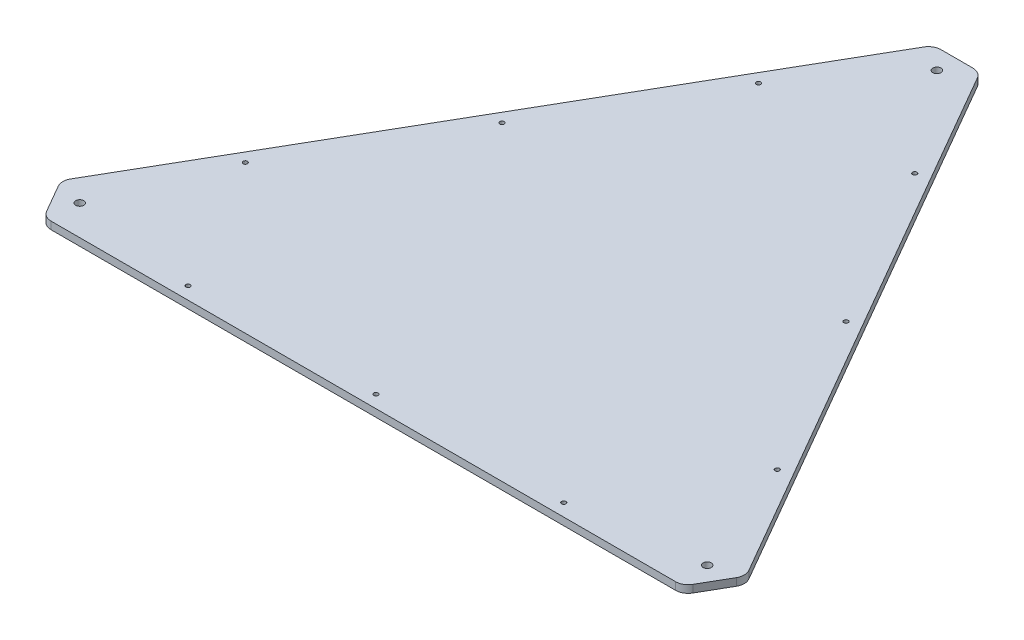
ISO-10303-21;
HEADER;
FILE_DESCRIPTION(('STEP AP214'),'2;1');
FILE_NAME('part.step','',(''),(''),'','','');
FILE_SCHEMA(('AUTOMOTIVE_DESIGN { 1 0 10303 214 1 1 1 1 }'));
ENDSEC;
DATA;
#1=APPLICATION_CONTEXT('core data for automotive mechanical design processes');
#2=APPLICATION_PROTOCOL_DEFINITION('international standard','automotive_design',2000,#1);
#3=PRODUCT_CONTEXT('',#1,'mechanical');
#4=PRODUCT('Part','Part','',(#3));
#5=PRODUCT_RELATED_PRODUCT_CATEGORY('part','',(#4));
#6=PRODUCT_DEFINITION_FORMATION('','',#4);
#7=PRODUCT_DEFINITION_CONTEXT('part definition',#1,'design');
#8=PRODUCT_DEFINITION('design','',#6,#7);
#9=PRODUCT_DEFINITION_SHAPE('','',#8);
#10=(LENGTH_UNIT() NAMED_UNIT(*) SI_UNIT(.MILLI.,.METRE.));
#11=(NAMED_UNIT(*) PLANE_ANGLE_UNIT() SI_UNIT($,.RADIAN.));
#12=(NAMED_UNIT(*) SI_UNIT($,.STERADIAN.) SOLID_ANGLE_UNIT());
#13=UNCERTAINTY_MEASURE_WITH_UNIT(LENGTH_MEASURE(1.E-05),#10,'distance_accuracy_value','');
#14=(GEOMETRIC_REPRESENTATION_CONTEXT(3) GLOBAL_UNCERTAINTY_ASSIGNED_CONTEXT((#13)) GLOBAL_UNIT_ASSIGNED_CONTEXT((#10,
#11,#12)) REPRESENTATION_CONTEXT('',''));
#15=CARTESIAN_POINT('',(0.,0.,0.));
#16=DIRECTION('',(0.,0.,1.));
#17=DIRECTION('',(1.,0.,0.));
#18=AXIS2_PLACEMENT_3D('',#15,#16,#17);
#19=CARTESIAN_POINT('',(0.,3.,0.));
#20=DIRECTION('',(0.,1.,0.));
#21=DIRECTION('',(0.,0.,1.));
#22=AXIS2_PLACEMENT_3D('',#19,#20,#21);
#23=PLANE('',#22);
#24=CARTESIAN_POINT('',(-150.,3.,158.680979980009));
#25=DIRECTION('',(0.,-1.,0.));
#26=DIRECTION('',(0.,0.,-1.));
#27=AXIS2_PLACEMENT_3D('',#24,#25,#26);
#28=CIRCLE('',#27,1.75);
#29=CARTESIAN_POINT('',(-150.,3.,156.930979980009));
#30=VERTEX_POINT('',#29);
#31=EDGE_CURVE('E333',#30,#30,#28,.T.);
#32=ORIENTED_EDGE('',*,*,#31,.T.);
#33=EDGE_LOOP('',(#32));
#34=FACE_BOUND('',#33,.T.);
#35=CARTESIAN_POINT('',(0.,3.,158.680979980009));
#36=DIRECTION('',(0.,-1.,0.));
#37=DIRECTION('',(0.,0.,-1.));
#38=AXIS2_PLACEMENT_3D('',#35,#36,#37);
#39=CIRCLE('',#38,1.75);
#40=CARTESIAN_POINT('',(0.,3.,156.930979980009));
#41=VERTEX_POINT('',#40);
#42=EDGE_CURVE('E325',#41,#41,#39,.T.);
#43=ORIENTED_EDGE('',*,*,#42,.T.);
#44=EDGE_LOOP('',(#43));
#45=FACE_BOUND('',#44,.T.);
#46=CARTESIAN_POINT('',(150.,3.,158.680979980009));
#47=DIRECTION('',(0.,-1.,0.));
#48=DIRECTION('',(0.,0.,-1.));
#49=AXIS2_PLACEMENT_3D('',#46,#47,#48);
#50=CIRCLE('',#49,1.75);
#51=CARTESIAN_POINT('',(150.,3.,156.930979980009));
#52=VERTEX_POINT('',#51);
#53=EDGE_CURVE('E317',#52,#52,#50,.T.);
#54=ORIENTED_EDGE('',*,*,#53,.T.);
#55=EDGE_LOOP('',(#54));
#56=FACE_BOUND('',#55,.T.);
#57=CARTESIAN_POINT('',(212.421759760098,3.,50.5633205776612));
#58=DIRECTION('',(0.,-1.,0.));
#59=DIRECTION('',(0.,0.,-1.));
#60=AXIS2_PLACEMENT_3D('',#57,#58,#59);
#61=CIRCLE('',#60,1.75);
#62=CARTESIAN_POINT('',(212.421759760098,3.,48.8133205776612));
#63=VERTEX_POINT('',#62);
#64=EDGE_CURVE('E310',#63,#63,#61,.T.);
#65=ORIENTED_EDGE('',*,*,#64,.T.);
#66=EDGE_LOOP('',(#65));
#67=FACE_BOUND('',#66,.T.);
#68=CARTESIAN_POINT('',(137.421759760098,3.,-79.3404899900046));
#69=DIRECTION('',(0.,-1.,0.));
#70=DIRECTION('',(0.,0.,-1.));
#71=AXIS2_PLACEMENT_3D('',#68,#69,#70);
#72=CIRCLE('',#71,1.75);
#73=CARTESIAN_POINT('',(137.421759760098,3.,-81.0904899900047));
#74=VERTEX_POINT('',#73);
#75=EDGE_CURVE('E299',#74,#74,#72,.T.);
#76=ORIENTED_EDGE('',*,*,#75,.T.);
#77=EDGE_LOOP('',(#76));
#78=FACE_BOUND('',#77,.T.);
#79=CARTESIAN_POINT('',(62.4217597600978,3.,-209.24430055767));
#80=DIRECTION('',(0.,-1.,0.));
#81=DIRECTION('',(0.,0.,-1.));
#82=AXIS2_PLACEMENT_3D('',#79,#80,#81);
#83=CIRCLE('',#82,1.75);
#84=CARTESIAN_POINT('',(62.4217597600978,3.,-210.99430055767));
#85=VERTEX_POINT('',#84);
#86=EDGE_CURVE('E291',#85,#85,#83,.T.);
#87=ORIENTED_EDGE('',*,*,#86,.T.);
#88=EDGE_LOOP('',(#87));
#89=FACE_BOUND('',#88,.T.);
#90=CARTESIAN_POINT('',(-62.4217597600952,3.,-209.244300557669));
#91=DIRECTION('',(0.,-1.,0.));
#92=DIRECTION('',(0.,0.,-1.));
#93=AXIS2_PLACEMENT_3D('',#90,#91,#92);
#94=CIRCLE('',#93,1.75);
#95=CARTESIAN_POINT('',(-62.4217597600952,3.,-210.994300557669));
#96=VERTEX_POINT('',#95);
#97=EDGE_CURVE('E284',#96,#96,#94,.T.);
#98=ORIENTED_EDGE('',*,*,#97,.T.);
#99=EDGE_LOOP('',(#98));
#100=FACE_BOUND('',#99,.T.);
#101=CARTESIAN_POINT('',(-137.421759760098,3.,-79.3404899900046));
#102=DIRECTION('',(0.,-1.,0.));
#103=DIRECTION('',(0.,0.,-1.));
#104=AXIS2_PLACEMENT_3D('',#101,#102,#103);
#105=CIRCLE('',#104,1.75);
#106=CARTESIAN_POINT('',(-137.421759760098,3.,-81.0904899900047));
#107=VERTEX_POINT('',#106);
#108=EDGE_CURVE('E273',#107,#107,#105,.T.);
#109=ORIENTED_EDGE('',*,*,#108,.T.);
#110=EDGE_LOOP('',(#109));
#111=FACE_BOUND('',#110,.T.);
#112=CARTESIAN_POINT('',(-212.4217597601,3.,50.5633205776597));
#113=DIRECTION('',(0.,-1.,0.));
#114=DIRECTION('',(0.,0.,-1.));
#115=AXIS2_PLACEMENT_3D('',#112,#113,#114);
#116=CIRCLE('',#115,1.75);
#117=CARTESIAN_POINT('',(-212.4217597601,3.,48.8133205776597));
#118=VERTEX_POINT('',#117);
#119=EDGE_CURVE('E262',#118,#118,#116,.T.);
#120=ORIENTED_EDGE('',*,*,#119,.T.);
#121=EDGE_LOOP('',(#120));
#122=FACE_BOUND('',#121,.T.);
#123=CARTESIAN_POINT('',(-250.557621135329,3.,144.659510009996));
#124=DIRECTION('',(0.,1.,0.));
#125=DIRECTION('',(0.,0.,1.));
#126=AXIS2_PLACEMENT_3D('',#123,#124,#125);
#127=CIRCLE('',#126,3.25000000000004);
#128=CARTESIAN_POINT('',(-250.557621135329,3.,147.909510009996));
#129=VERTEX_POINT('',#128);
#130=EDGE_CURVE('E243',#129,#129,#127,.T.);
#131=ORIENTED_EDGE('',*,*,#130,.F.);
#132=EDGE_LOOP('',(#131));
#133=FACE_BOUND('',#132,.T.);
#134=DIRECTION('',(0.499999999999942,0.,-0.866025403784472));
#135=VECTOR('',#134,1.);
#136=CARTESIAN_POINT('',(255.164027595881,3.,168.680979980009));
#137=LINE('',#136,#135);
#138=CARTESIAN_POINT('',(258.050778941829,3.,163.680979980008));
#139=VERTEX_POINT('',#138);
#140=CARTESIAN_POINT('',(270.777276249931,3.,141.638040039983));
#141=VERTEX_POINT('',#140);
#142=EDGE_CURVE('E176',#139,#141,#137,.T.);
#143=ORIENTED_EDGE('',*,*,#142,.T.);
#144=CARTESIAN_POINT('',(262.117022212087,3.,136.638040039984));
#145=DIRECTION('',(0.,1.,0.));
#146=DIRECTION('',(0.,0.,1.));
#147=AXIS2_PLACEMENT_3D('',#144,#145,#146);
#148=CIRCLE('',#147,10.);
#149=CARTESIAN_POINT('',(270.777276249931,3.,131.638040039984));
#150=VERTEX_POINT('',#149);
#151=EDGE_CURVE('E229',#141,#150,#148,.T.);
#152=ORIENTED_EDGE('',*,*,#151,.T.);
#153=DIRECTION('',(-0.499999999999996,0.,-0.866025403784441));
#154=VECTOR('',#153,1.);
#155=CARTESIAN_POINT('',(273.664027595879,3.,136.638040039983));
#156=LINE('',#155,#154);
#157=CARTESIAN_POINT('',(21.3867513459481,3.,-300.319020019991));
#158=VERTEX_POINT('',#157);
#159=EDGE_CURVE('E151',#150,#158,#156,.T.);
#160=ORIENTED_EDGE('',*,*,#159,.T.);
#161=CARTESIAN_POINT('',(12.7264973081037,3.,-295.319020019991));
#162=DIRECTION('',(0.,1.,0.));
#163=DIRECTION('',(0.,0.,1.));
#164=AXIS2_PLACEMENT_3D('',#161,#162,#163);
#165=CIRCLE('',#164,10.);
#166=CARTESIAN_POINT('',(12.7264973081037,3.,-305.319020019991));
#167=VERTEX_POINT('',#166);
#168=EDGE_CURVE('E193',#158,#167,#165,.T.);
#169=ORIENTED_EDGE('',*,*,#168,.T.);
#170=DIRECTION('',(-1.,0.,0.));
#171=VECTOR('',#170,1.);
#172=CARTESIAN_POINT('',(18.5,3.,-305.319020019991));
#173=LINE('',#172,#171);
#174=CARTESIAN_POINT('',(-12.7264973081037,3.,-305.319020019991));
#175=VERTEX_POINT('',#174);
#176=EDGE_CURVE('E210',#167,#175,#173,.T.);
#177=ORIENTED_EDGE('',*,*,#176,.T.);
#178=CARTESIAN_POINT('',(-12.7264973081037,3.,-295.319020019991));
#179=DIRECTION('',(0.,1.,0.));
#180=DIRECTION('',(0.,0.,1.));
#181=AXIS2_PLACEMENT_3D('',#178,#179,#180);
#182=CIRCLE('',#181,10.);
#183=CARTESIAN_POINT('',(-21.3867513459481,3.,-300.319020019991));
#184=VERTEX_POINT('',#183);
#185=EDGE_CURVE('E189',#175,#184,#182,.T.);
#186=ORIENTED_EDGE('',*,*,#185,.T.);
#187=DIRECTION('',(-0.499999999999996,0.,0.866025403784441));
#188=VECTOR('',#187,1.);
#189=CARTESIAN_POINT('',(-18.5,3.,-305.319020019991));
#190=LINE('',#189,#188);
#191=CARTESIAN_POINT('',(-270.777276249931,3.,131.638040039984));
#192=VERTEX_POINT('',#191);
#193=EDGE_CURVE('E204',#184,#192,#190,.T.);
#194=ORIENTED_EDGE('',*,*,#193,.T.);
#195=CARTESIAN_POINT('',(-262.117022212087,3.,136.638040039984));
#196=DIRECTION('',(0.,1.,0.));
#197=DIRECTION('',(0.,0.,1.));
#198=AXIS2_PLACEMENT_3D('',#195,#196,#197);
#199=CIRCLE('',#198,10.);
#200=CARTESIAN_POINT('',(-270.777276249931,3.,141.638040039983));
#201=VERTEX_POINT('',#200);
#202=EDGE_CURVE('E224',#192,#201,#199,.T.);
#203=ORIENTED_EDGE('',*,*,#202,.T.);
#204=DIRECTION('',(0.499999999999942,0.,0.866025403784472));
#205=VECTOR('',#204,1.);
#206=CARTESIAN_POINT('',(-273.664027595879,3.,136.638040039983));
#207=LINE('',#206,#205);
#208=CARTESIAN_POINT('',(-258.050778941829,3.,163.680979980008));
#209=VERTEX_POINT('',#208);
#210=EDGE_CURVE('E209',#201,#209,#207,.T.);
#211=ORIENTED_EDGE('',*,*,#210,.T.);
#212=CARTESIAN_POINT('',(-249.390524903984,3.,158.680979980009));
#213=DIRECTION('',(0.,1.,0.));
#214=DIRECTION('',(0.,0.,1.));
#215=AXIS2_PLACEMENT_3D('',#212,#213,#214);
#216=CIRCLE('',#215,10.);
#217=CARTESIAN_POINT('',(-249.390524903984,3.,168.680979980009));
#218=VERTEX_POINT('',#217);
#219=EDGE_CURVE('E62',#209,#218,#216,.T.);
#220=ORIENTED_EDGE('',*,*,#219,.T.);
#221=DIRECTION('',(1.,0.,0.));
#222=VECTOR('',#221,1.);
#223=CARTESIAN_POINT('',(-255.164027595881,3.,168.680979980009));
#224=LINE('',#223,#222);
#225=CARTESIAN_POINT('',(249.390524903984,3.,168.680979980009));
#226=VERTEX_POINT('',#225);
#227=EDGE_CURVE('E177',#218,#226,#224,.T.);
#228=ORIENTED_EDGE('',*,*,#227,.T.);
#229=CARTESIAN_POINT('',(249.390524903984,3.,158.680979980009));
#230=DIRECTION('',(0.,1.,0.));
#231=DIRECTION('',(0.,0.,1.));
#232=AXIS2_PLACEMENT_3D('',#229,#230,#231);
#233=CIRCLE('',#232,10.);
#234=EDGE_CURVE('E223',#226,#139,#233,.T.);
#235=ORIENTED_EDGE('',*,*,#234,.T.);
#236=EDGE_LOOP('',(#143,#152,#160,#169,#177,#186,#194,#203,#211,#220,#228,#235));
#237=FACE_BOUND('',#236,.T.);
#238=CARTESIAN_POINT('',(0.,3.,-289.319020019991));
#239=DIRECTION('',(0.,1.,0.));
#240=DIRECTION('',(0.,0.,1.));
#241=AXIS2_PLACEMENT_3D('',#238,#239,#240);
#242=CIRCLE('',#241,3.25);
#243=CARTESIAN_POINT('',(0.,3.,-286.069020019991));
#244=VERTEX_POINT('',#243);
#245=EDGE_CURVE('E165',#244,#244,#242,.T.);
#246=ORIENTED_EDGE('',*,*,#245,.F.);
#247=EDGE_LOOP('',(#246));
#248=FACE_BOUND('',#247,.T.);
#249=CARTESIAN_POINT('',(250.557621135329,3.,144.659510009996));
#250=DIRECTION('',(0.,1.,0.));
#251=DIRECTION('',(0.,0.,1.));
#252=AXIS2_PLACEMENT_3D('',#249,#250,#251);
#253=CIRCLE('',#252,3.25000000000017);
#254=CARTESIAN_POINT('',(250.557621135329,3.,147.909510009996));
#255=VERTEX_POINT('',#254);
#256=EDGE_CURVE('E261',#255,#255,#253,.T.);
#257=ORIENTED_EDGE('',*,*,#256,.F.);
#258=EDGE_LOOP('',(#257));
#259=FACE_BOUND('',#258,.T.);
#260=ADVANCED_FACE('F40',(#34,#45,#56,#67,#78,#89,#100,#111,#122,#133,#237,#248,#259),#23,.T.);
#261=CARTESIAN_POINT('',(0.,-3.,0.));
#262=DIRECTION('',(0.,1.,0.));
#263=DIRECTION('',(0.,0.,1.));
#264=AXIS2_PLACEMENT_3D('',#261,#262,#263);
#265=PLANE('',#264);
#266=CARTESIAN_POINT('',(-150.,-3.,158.680979980009));
#267=DIRECTION('',(0.,-1.,0.));
#268=DIRECTION('',(0.,0.,-1.));
#269=AXIS2_PLACEMENT_3D('',#266,#267,#268);
#270=CIRCLE('',#269,1.75);
#271=CARTESIAN_POINT('',(-150.,-3.,156.930979980009));
#272=VERTEX_POINT('',#271);
#273=EDGE_CURVE('E338',#272,#272,#270,.T.);
#274=ORIENTED_EDGE('',*,*,#273,.F.);
#275=EDGE_LOOP('',(#274));
#276=FACE_BOUND('',#275,.T.);
#277=CARTESIAN_POINT('',(0.,-3.,158.680979980009));
#278=DIRECTION('',(0.,-1.,0.));
#279=DIRECTION('',(0.,0.,-1.));
#280=AXIS2_PLACEMENT_3D('',#277,#278,#279);
#281=CIRCLE('',#280,1.75);
#282=CARTESIAN_POINT('',(0.,-3.,156.930979980009));
#283=VERTEX_POINT('',#282);
#284=EDGE_CURVE('E330',#283,#283,#281,.T.);
#285=ORIENTED_EDGE('',*,*,#284,.F.);
#286=EDGE_LOOP('',(#285));
#287=FACE_BOUND('',#286,.T.);
#288=CARTESIAN_POINT('',(150.,-3.,158.680979980009));
#289=DIRECTION('',(0.,-1.,0.));
#290=DIRECTION('',(0.,0.,-1.));
#291=AXIS2_PLACEMENT_3D('',#288,#289,#290);
#292=CIRCLE('',#291,1.75);
#293=CARTESIAN_POINT('',(150.,-3.,156.930979980009));
#294=VERTEX_POINT('',#293);
#295=EDGE_CURVE('E322',#294,#294,#292,.T.);
#296=ORIENTED_EDGE('',*,*,#295,.F.);
#297=EDGE_LOOP('',(#296));
#298=FACE_BOUND('',#297,.T.);
#299=CARTESIAN_POINT('',(212.421759760098,-3.,50.5633205776612));
#300=DIRECTION('',(0.,-1.,0.));
#301=DIRECTION('',(0.,0.,-1.));
#302=AXIS2_PLACEMENT_3D('',#299,#300,#301);
#303=CIRCLE('',#302,1.75);
#304=CARTESIAN_POINT('',(212.421759760098,-3.,48.8133205776612));
#305=VERTEX_POINT('',#304);
#306=EDGE_CURVE('E315',#305,#305,#303,.T.);
#307=ORIENTED_EDGE('',*,*,#306,.F.);
#308=EDGE_LOOP('',(#307));
#309=FACE_BOUND('',#308,.T.);
#310=CARTESIAN_POINT('',(137.421759760098,-3.,-79.3404899900046));
#311=DIRECTION('',(0.,-1.,0.));
#312=DIRECTION('',(0.,0.,-1.));
#313=AXIS2_PLACEMENT_3D('',#310,#311,#312);
#314=CIRCLE('',#313,1.75);
#315=CARTESIAN_POINT('',(137.421759760098,-3.,-81.0904899900047));
#316=VERTEX_POINT('',#315);
#317=EDGE_CURVE('E304',#316,#316,#314,.T.);
#318=ORIENTED_EDGE('',*,*,#317,.F.);
#319=EDGE_LOOP('',(#318));
#320=FACE_BOUND('',#319,.T.);
#321=CARTESIAN_POINT('',(62.4217597600978,-3.,-209.24430055767));
#322=DIRECTION('',(0.,-1.,0.));
#323=DIRECTION('',(0.,0.,-1.));
#324=AXIS2_PLACEMENT_3D('',#321,#322,#323);
#325=CIRCLE('',#324,1.75);
#326=CARTESIAN_POINT('',(62.4217597600978,-3.,-210.99430055767));
#327=VERTEX_POINT('',#326);
#328=EDGE_CURVE('E296',#327,#327,#325,.T.);
#329=ORIENTED_EDGE('',*,*,#328,.F.);
#330=EDGE_LOOP('',(#329));
#331=FACE_BOUND('',#330,.T.);
#332=CARTESIAN_POINT('',(-62.4217597600952,-3.,-209.244300557669));
#333=DIRECTION('',(0.,-1.,0.));
#334=DIRECTION('',(0.,0.,-1.));
#335=AXIS2_PLACEMENT_3D('',#332,#333,#334);
#336=CIRCLE('',#335,1.75);
#337=CARTESIAN_POINT('',(-62.4217597600952,-3.,-210.994300557669));
#338=VERTEX_POINT('',#337);
#339=EDGE_CURVE('E289',#338,#338,#336,.T.);
#340=ORIENTED_EDGE('',*,*,#339,.F.);
#341=EDGE_LOOP('',(#340));
#342=FACE_BOUND('',#341,.T.);
#343=CARTESIAN_POINT('',(-137.421759760098,-3.,-79.3404899900046));
#344=DIRECTION('',(0.,-1.,0.));
#345=DIRECTION('',(0.,0.,-1.));
#346=AXIS2_PLACEMENT_3D('',#343,#344,#345);
#347=CIRCLE('',#346,1.75);
#348=CARTESIAN_POINT('',(-137.421759760098,-3.,-81.0904899900047));
#349=VERTEX_POINT('',#348);
#350=EDGE_CURVE('E278',#349,#349,#347,.T.);
#351=ORIENTED_EDGE('',*,*,#350,.F.);
#352=EDGE_LOOP('',(#351));
#353=FACE_BOUND('',#352,.T.);
#354=CARTESIAN_POINT('',(-212.4217597601,-3.,50.5633205776597));
#355=DIRECTION('',(0.,-1.,0.));
#356=DIRECTION('',(0.,0.,-1.));
#357=AXIS2_PLACEMENT_3D('',#354,#355,#356);
#358=CIRCLE('',#357,1.75);
#359=CARTESIAN_POINT('',(-212.4217597601,-3.,48.8133205776597));
#360=VERTEX_POINT('',#359);
#361=EDGE_CURVE('E270',#360,#360,#358,.T.);
#362=ORIENTED_EDGE('',*,*,#361,.F.);
#363=EDGE_LOOP('',(#362));
#364=FACE_BOUND('',#363,.T.);
#365=DIRECTION('',(-0.499999999999996,0.,-0.866025403784441));
#366=VECTOR('',#365,1.);
#367=CARTESIAN_POINT('',(273.664027595879,-3.,136.638040039983));
#368=LINE('',#367,#366);
#369=CARTESIAN_POINT('',(270.777276249931,-3.,131.638040039984));
#370=VERTEX_POINT('',#369);
#371=CARTESIAN_POINT('',(21.3867513459481,-3.,-300.319020019991));
#372=VERTEX_POINT('',#371);
#373=EDGE_CURVE('E148',#370,#372,#368,.T.);
#374=ORIENTED_EDGE('',*,*,#373,.F.);
#375=CARTESIAN_POINT('',(262.117022212087,-3.,136.638040039984));
#376=DIRECTION('',(0.,1.,0.));
#377=DIRECTION('',(0.,0.,1.));
#378=AXIS2_PLACEMENT_3D('',#375,#376,#377);
#379=CIRCLE('',#378,10.);
#380=CARTESIAN_POINT('',(270.777276249931,-3.,141.638040039983));
#381=VERTEX_POINT('',#380);
#382=EDGE_CURVE('E131',#370,#381,#379,.F.);
#383=ORIENTED_EDGE('',*,*,#382,.T.);
#384=DIRECTION('',(0.499999999999942,0.,-0.866025403784472));
#385=VECTOR('',#384,1.);
#386=CARTESIAN_POINT('',(255.164027595881,-3.,168.680979980009));
#387=LINE('',#386,#385);
#388=CARTESIAN_POINT('',(258.050778941829,-3.,163.680979980008));
#389=VERTEX_POINT('',#388);
#390=EDGE_CURVE('E160',#389,#381,#387,.T.);
#391=ORIENTED_EDGE('',*,*,#390,.F.);
#392=CARTESIAN_POINT('',(249.390524903984,-3.,158.680979980009));
#393=DIRECTION('',(0.,1.,0.));
#394=DIRECTION('',(0.,0.,1.));
#395=AXIS2_PLACEMENT_3D('',#392,#393,#394);
#396=CIRCLE('',#395,10.);
#397=CARTESIAN_POINT('',(249.390524903984,-3.,168.680979980009));
#398=VERTEX_POINT('',#397);
#399=EDGE_CURVE('E142',#389,#398,#396,.F.);
#400=ORIENTED_EDGE('',*,*,#399,.T.);
#401=DIRECTION('',(1.,0.,0.));
#402=VECTOR('',#401,1.);
#403=CARTESIAN_POINT('',(-255.164027595881,-3.,168.680979980009));
#404=LINE('',#403,#402);
#405=CARTESIAN_POINT('',(-249.390524903984,-3.,168.680979980009));
#406=VERTEX_POINT('',#405);
#407=EDGE_CURVE('E174',#406,#398,#404,.T.);
#408=ORIENTED_EDGE('',*,*,#407,.F.);
#409=CARTESIAN_POINT('',(-249.390524903984,-3.,158.680979980009));
#410=DIRECTION('',(0.,1.,0.));
#411=DIRECTION('',(0.,0.,1.));
#412=AXIS2_PLACEMENT_3D('',#409,#410,#411);
#413=CIRCLE('',#412,10.);
#414=CARTESIAN_POINT('',(-258.050778941829,-3.,163.680979980008));
#415=VERTEX_POINT('',#414);
#416=EDGE_CURVE('E183',#406,#415,#413,.F.);
#417=ORIENTED_EDGE('',*,*,#416,.T.);
#418=DIRECTION('',(0.499999999999942,0.,0.866025403784472));
#419=VECTOR('',#418,1.);
#420=CARTESIAN_POINT('',(-273.664027595879,-3.,136.638040039983));
#421=LINE('',#420,#419);
#422=CARTESIAN_POINT('',(-270.777276249931,-3.,141.638040039983));
#423=VERTEX_POINT('',#422);
#424=EDGE_CURVE('E171',#423,#415,#421,.T.);
#425=ORIENTED_EDGE('',*,*,#424,.F.);
#426=CARTESIAN_POINT('',(-262.117022212087,-3.,136.638040039984));
#427=DIRECTION('',(0.,1.,0.));
#428=DIRECTION('',(0.,0.,1.));
#429=AXIS2_PLACEMENT_3D('',#426,#427,#428);
#430=CIRCLE('',#429,10.);
#431=CARTESIAN_POINT('',(-270.777276249931,-3.,131.638040039984));
#432=VERTEX_POINT('',#431);
#433=EDGE_CURVE('E181',#423,#432,#430,.F.);
#434=ORIENTED_EDGE('',*,*,#433,.T.);
#435=DIRECTION('',(-0.499999999999996,0.,0.866025403784441));
#436=VECTOR('',#435,1.);
#437=CARTESIAN_POINT('',(-18.5,-3.,-305.319020019991));
#438=LINE('',#437,#436);
#439=CARTESIAN_POINT('',(-21.3867513459481,-3.,-300.319020019991));
#440=VERTEX_POINT('',#439);
#441=EDGE_CURVE('E163',#440,#432,#438,.T.);
#442=ORIENTED_EDGE('',*,*,#441,.F.);
#443=CARTESIAN_POINT('',(-12.7264973081037,-3.,-295.319020019991));
#444=DIRECTION('',(0.,1.,0.));
#445=DIRECTION('',(0.,0.,1.));
#446=AXIS2_PLACEMENT_3D('',#443,#444,#445);
#447=CIRCLE('',#446,10.);
#448=CARTESIAN_POINT('',(-12.7264973081037,-3.,-305.319020019991));
#449=VERTEX_POINT('',#448);
#450=EDGE_CURVE('E152',#440,#449,#447,.F.);
#451=ORIENTED_EDGE('',*,*,#450,.T.);
#452=DIRECTION('',(-1.,0.,0.));
#453=VECTOR('',#452,1.);
#454=CARTESIAN_POINT('',(18.5,-3.,-305.319020019991));
#455=LINE('',#454,#453);
#456=CARTESIAN_POINT('',(12.7264973081037,-3.,-305.319020019991));
#457=VERTEX_POINT('',#456);
#458=EDGE_CURVE('E159',#457,#449,#455,.T.);
#459=ORIENTED_EDGE('',*,*,#458,.F.);
#460=CARTESIAN_POINT('',(12.7264973081037,-3.,-295.319020019991));
#461=DIRECTION('',(0.,1.,0.));
#462=DIRECTION('',(0.,0.,1.));
#463=AXIS2_PLACEMENT_3D('',#460,#461,#462);
#464=CIRCLE('',#463,10.);
#465=EDGE_CURVE('E158',#457,#372,#464,.F.);
#466=ORIENTED_EDGE('',*,*,#465,.T.);
#467=EDGE_LOOP('',(#374,#383,#391,#400,#408,#417,#425,#434,#442,#451,#459,#466));
#468=FACE_BOUND('',#467,.T.);
#469=CARTESIAN_POINT('',(0.,-3.,-289.319020019991));
#470=DIRECTION('',(0.,1.,0.));
#471=DIRECTION('',(0.,0.,1.));
#472=AXIS2_PLACEMENT_3D('',#469,#470,#471);
#473=CIRCLE('',#472,3.25);
#474=CARTESIAN_POINT('',(0.,-3.,-286.069020019991));
#475=VERTEX_POINT('',#474);
#476=EDGE_CURVE('E238',#475,#475,#473,.T.);
#477=ORIENTED_EDGE('',*,*,#476,.T.);
#478=EDGE_LOOP('',(#477));
#479=FACE_BOUND('',#478,.T.);
#480=CARTESIAN_POINT('',(-250.557621135329,-3.,144.659510009996));
#481=DIRECTION('',(0.,1.,0.));
#482=DIRECTION('',(0.,0.,1.));
#483=AXIS2_PLACEMENT_3D('',#480,#481,#482);
#484=CIRCLE('',#483,3.25000000000004);
#485=CARTESIAN_POINT('',(-250.557621135329,-3.,147.909510009996));
#486=VERTEX_POINT('',#485);
#487=EDGE_CURVE('E239',#486,#486,#484,.T.);
#488=ORIENTED_EDGE('',*,*,#487,.T.);
#489=EDGE_LOOP('',(#488));
#490=FACE_BOUND('',#489,.T.);
#491=CARTESIAN_POINT('',(250.557621135329,-3.,144.659510009996));
#492=DIRECTION('',(0.,1.,0.));
#493=DIRECTION('',(0.,0.,1.));
#494=AXIS2_PLACEMENT_3D('',#491,#492,#493);
#495=CIRCLE('',#494,3.25000000000017);
#496=CARTESIAN_POINT('',(250.557621135329,-3.,147.909510009996));
#497=VERTEX_POINT('',#496);
#498=EDGE_CURVE('E259',#497,#497,#495,.T.);
#499=ORIENTED_EDGE('',*,*,#498,.T.);
#500=EDGE_LOOP('',(#499));
#501=FACE_BOUND('',#500,.T.);
#502=ADVANCED_FACE('F155',(#276,#287,#298,#309,#320,#331,#342,#353,#364,#468,#479,#490,#501),
#265,.F.);
#503=CARTESIAN_POINT('',(255.164027595881,3.,168.680979980009));
#504=DIRECTION('',(-0.866025403784472,0.,-0.499999999999942));
#505=DIRECTION('',(-0.499999999999942,0.,0.866025403784472));
#506=AXIS2_PLACEMENT_3D('',#503,#504,#505);
#507=PLANE('',#506);
#508=ORIENTED_EDGE('',*,*,#390,.T.);
#509=DIRECTION('',(0.,-1.,0.));
#510=VECTOR('',#509,1.);
#511=CARTESIAN_POINT('',(270.777276249931,3.,141.638040039983));
#512=LINE('',#511,#510);
#513=EDGE_CURVE('E136',#381,#141,#512,.F.);
#514=ORIENTED_EDGE('',*,*,#513,.T.);
#515=ORIENTED_EDGE('',*,*,#142,.F.);
#516=DIRECTION('',(0.,-1.,0.));
#517=VECTOR('',#516,1.);
#518=CARTESIAN_POINT('',(258.050778941829,3.,163.680979980008));
#519=LINE('',#518,#517);
#520=EDGE_CURVE('E141',#139,#389,#519,.T.);
#521=ORIENTED_EDGE('',*,*,#520,.T.);
#522=EDGE_LOOP('',(#508,#514,#515,#521));
#523=FACE_BOUND('',#522,.T.);
#524=ADVANCED_FACE('F346',(#523),#507,.F.);
#525=CARTESIAN_POINT('',(273.664027595879,3.,136.638040039983));
#526=DIRECTION('',(-0.866025403784441,0.,0.499999999999996));
#527=DIRECTION('',(0.499999999999996,0.,0.866025403784441));
#528=AXIS2_PLACEMENT_3D('',#525,#526,#527);
#529=PLANE('',#528);
#530=ORIENTED_EDGE('',*,*,#159,.F.);
#531=DIRECTION('',(0.,-1.,0.));
#532=VECTOR('',#531,1.);
#533=CARTESIAN_POINT('',(270.777276249931,3.,131.638040039984));
#534=LINE('',#533,#532);
#535=EDGE_CURVE('E135',#150,#370,#534,.T.);
#536=ORIENTED_EDGE('',*,*,#535,.T.);
#537=ORIENTED_EDGE('',*,*,#373,.T.);
#538=DIRECTION('',(0.,-1.,0.));
#539=VECTOR('',#538,1.);
#540=CARTESIAN_POINT('',(21.3867513459481,3.,-300.319020019991));
#541=LINE('',#540,#539);
#542=EDGE_CURVE('E153',#372,#158,#541,.F.);
#543=ORIENTED_EDGE('',*,*,#542,.T.);
#544=EDGE_LOOP('',(#530,#536,#537,#543));
#545=FACE_BOUND('',#544,.T.);
#546=ADVANCED_FACE('F147',(#545),#529,.F.);
#547=CARTESIAN_POINT('',(18.5,3.,-305.319020019991));
#548=DIRECTION('',(0.,0.,1.));
#549=DIRECTION('',(1.,0.,0.));
#550=AXIS2_PLACEMENT_3D('',#547,#548,#549);
#551=PLANE('',#550);
#552=ORIENTED_EDGE('',*,*,#176,.F.);
#553=DIRECTION('',(0.,-1.,0.));
#554=VECTOR('',#553,1.);
#555=CARTESIAN_POINT('',(12.7264973081037,3.,-305.319020019991));
#556=LINE('',#555,#554);
#557=EDGE_CURVE('E12',#167,#457,#556,.T.);
#558=ORIENTED_EDGE('',*,*,#557,.T.);
#559=ORIENTED_EDGE('',*,*,#458,.T.);
#560=DIRECTION('',(0.,-1.,0.));
#561=VECTOR('',#560,1.);
#562=CARTESIAN_POINT('',(-12.7264973081037,3.,-305.319020019991));
#563=LINE('',#562,#561);
#564=EDGE_CURVE('E48',#449,#175,#563,.F.);
#565=ORIENTED_EDGE('',*,*,#564,.T.);
#566=EDGE_LOOP('',(#552,#558,#559,#565));
#567=FACE_BOUND('',#566,.T.);
#568=ADVANCED_FACE('F403',(#567),#551,.F.);
#569=CARTESIAN_POINT('',(-18.5,3.,-305.319020019991));
#570=DIRECTION('',(0.866025403784441,0.,0.499999999999996));
#571=DIRECTION('',(0.499999999999996,0.,-0.866025403784441));
#572=AXIS2_PLACEMENT_3D('',#569,#570,#571);
#573=PLANE('',#572);
#574=ORIENTED_EDGE('',*,*,#441,.T.);
#575=DIRECTION('',(0.,-1.,0.));
#576=VECTOR('',#575,1.);
#577=CARTESIAN_POINT('',(-270.777276249931,3.,131.638040039984));
#578=LINE('',#577,#576);
#579=EDGE_CURVE('E458',#432,#192,#578,.F.);
#580=ORIENTED_EDGE('',*,*,#579,.T.);
#581=ORIENTED_EDGE('',*,*,#193,.F.);
#582=DIRECTION('',(0.,-1.,0.));
#583=VECTOR('',#582,1.);
#584=CARTESIAN_POINT('',(-21.3867513459481,3.,-300.319020019991));
#585=LINE('',#584,#583);
#586=EDGE_CURVE('E451',#184,#440,#585,.T.);
#587=ORIENTED_EDGE('',*,*,#586,.T.);
#588=EDGE_LOOP('',(#574,#580,#581,#587));
#589=FACE_BOUND('',#588,.T.);
#590=ADVANCED_FACE('F399',(#589),#573,.F.);
#591=CARTESIAN_POINT('',(-273.664027595879,3.,136.638040039983));
#592=DIRECTION('',(0.866025403784472,0.,-0.499999999999942));
#593=DIRECTION('',(-0.499999999999942,0.,-0.866025403784472));
#594=AXIS2_PLACEMENT_3D('',#591,#592,#593);
#595=PLANE('',#594);
#596=ORIENTED_EDGE('',*,*,#424,.T.);
#597=DIRECTION('',(0.,-1.,0.));
#598=VECTOR('',#597,1.);
#599=CARTESIAN_POINT('',(-258.050778941829,3.,163.680979980008));
#600=LINE('',#599,#598);
#601=EDGE_CURVE('E449',#415,#209,#600,.F.);
#602=ORIENTED_EDGE('',*,*,#601,.T.);
#603=ORIENTED_EDGE('',*,*,#210,.F.);
#604=DIRECTION('',(0.,-1.,0.));
#605=VECTOR('',#604,1.);
#606=CARTESIAN_POINT('',(-270.777276249931,3.,141.638040039983));
#607=LINE('',#606,#605);
#608=EDGE_CURVE('E446',#201,#423,#607,.T.);
#609=ORIENTED_EDGE('',*,*,#608,.T.);
#610=EDGE_LOOP('',(#596,#602,#603,#609));
#611=FACE_BOUND('',#610,.T.);
#612=ADVANCED_FACE('F396',(#611),#595,.F.);
#613=CARTESIAN_POINT('',(-255.164027595881,3.,168.680979980009));
#614=DIRECTION('',(0.,0.,-1.));
#615=DIRECTION('',(-1.,0.,0.));
#616=AXIS2_PLACEMENT_3D('',#613,#614,#615);
#617=PLANE('',#616);
#618=ORIENTED_EDGE('',*,*,#407,.T.);
#619=DIRECTION('',(0.,-1.,0.));
#620=VECTOR('',#619,1.);
#621=CARTESIAN_POINT('',(249.390524903984,3.,168.680979980009));
#622=LINE('',#621,#620);
#623=EDGE_CURVE('E55',#398,#226,#622,.F.);
#624=ORIENTED_EDGE('',*,*,#623,.T.);
#625=ORIENTED_EDGE('',*,*,#227,.F.);
#626=DIRECTION('',(0.,-1.,0.));
#627=VECTOR('',#626,1.);
#628=CARTESIAN_POINT('',(-249.390524903984,3.,168.680979980009));
#629=LINE('',#628,#627);
#630=EDGE_CURVE('E453',#218,#406,#629,.T.);
#631=ORIENTED_EDGE('',*,*,#630,.T.);
#632=EDGE_LOOP('',(#618,#624,#625,#631));
#633=FACE_BOUND('',#632,.T.);
#634=ADVANCED_FACE('F393',(#633),#617,.F.);
#635=CARTESIAN_POINT('',(0.,3.,-289.319020019991));
#636=DIRECTION('',(0.,-1.,0.));
#637=DIRECTION('',(0.,0.,-1.));
#638=AXIS2_PLACEMENT_3D('',#635,#636,#637);
#639=CYLINDRICAL_SURFACE('',#638,3.25);
#640=ORIENTED_EDGE('',*,*,#245,.T.);
#641=EDGE_LOOP('',(#640));
#642=FACE_BOUND('',#641,.T.);
#643=ORIENTED_EDGE('',*,*,#476,.F.);
#644=EDGE_LOOP('',(#643));
#645=FACE_BOUND('',#644,.T.);
#646=ADVANCED_FACE('F390',(#642,#645),#639,.F.);
#647=CARTESIAN_POINT('',(-250.557621135329,3.,144.659510009996));
#648=DIRECTION('',(0.,-1.,0.));
#649=DIRECTION('',(0.,0.,-1.));
#650=AXIS2_PLACEMENT_3D('',#647,#648,#649);
#651=CYLINDRICAL_SURFACE('',#650,3.25000000000004);
#652=ORIENTED_EDGE('',*,*,#130,.T.);
#653=EDGE_LOOP('',(#652));
#654=FACE_BOUND('',#653,.T.);
#655=ORIENTED_EDGE('',*,*,#487,.F.);
#656=EDGE_LOOP('',(#655));
#657=FACE_BOUND('',#656,.T.);
#658=ADVANCED_FACE('F477',(#654,#657),#651,.F.);
#659=CARTESIAN_POINT('',(250.557621135329,3.,144.659510009996));
#660=DIRECTION('',(0.,-1.,0.));
#661=DIRECTION('',(0.,0.,-1.));
#662=AXIS2_PLACEMENT_3D('',#659,#660,#661);
#663=CYLINDRICAL_SURFACE('',#662,3.25000000000017);
#664=ORIENTED_EDGE('',*,*,#256,.T.);
#665=EDGE_LOOP('',(#664));
#666=FACE_BOUND('',#665,.T.);
#667=ORIENTED_EDGE('',*,*,#498,.F.);
#668=EDGE_LOOP('',(#667));
#669=FACE_BOUND('',#668,.T.);
#670=ADVANCED_FACE('F416',(#666,#669),#663,.F.);
#671=CARTESIAN_POINT('',(262.117022212087,3.,136.638040039984));
#672=DIRECTION('',(0.,-1.,0.));
#673=DIRECTION('',(0.,0.,-1.));
#674=AXIS2_PLACEMENT_3D('',#671,#672,#673);
#675=CYLINDRICAL_SURFACE('',#674,10.);
#676=ORIENTED_EDGE('',*,*,#151,.F.);
#677=ORIENTED_EDGE('',*,*,#513,.F.);
#678=ORIENTED_EDGE('',*,*,#382,.F.);
#679=ORIENTED_EDGE('',*,*,#535,.F.);
#680=EDGE_LOOP('',(#676,#677,#678,#679));
#681=FACE_BOUND('',#680,.T.);
#682=ADVANCED_FACE('F134',(#681),#675,.T.);
#683=CARTESIAN_POINT('',(249.390524903984,3.,158.680979980009));
#684=DIRECTION('',(0.,-1.,0.));
#685=DIRECTION('',(0.,0.,-1.));
#686=AXIS2_PLACEMENT_3D('',#683,#684,#685);
#687=CYLINDRICAL_SURFACE('',#686,10.);
#688=ORIENTED_EDGE('',*,*,#234,.F.);
#689=ORIENTED_EDGE('',*,*,#623,.F.);
#690=ORIENTED_EDGE('',*,*,#399,.F.);
#691=ORIENTED_EDGE('',*,*,#520,.F.);
#692=EDGE_LOOP('',(#688,#689,#690,#691));
#693=FACE_BOUND('',#692,.T.);
#694=ADVANCED_FACE('F415',(#693),#687,.T.);
#695=CARTESIAN_POINT('',(-249.390524903984,3.,158.680979980009));
#696=DIRECTION('',(0.,-1.,0.));
#697=DIRECTION('',(0.,0.,-1.));
#698=AXIS2_PLACEMENT_3D('',#695,#696,#697);
#699=CYLINDRICAL_SURFACE('',#698,10.);
#700=ORIENTED_EDGE('',*,*,#219,.F.);
#701=ORIENTED_EDGE('',*,*,#601,.F.);
#702=ORIENTED_EDGE('',*,*,#416,.F.);
#703=ORIENTED_EDGE('',*,*,#630,.F.);
#704=EDGE_LOOP('',(#700,#701,#702,#703));
#705=FACE_BOUND('',#704,.T.);
#706=ADVANCED_FACE('F419',(#705),#699,.T.);
#707=CARTESIAN_POINT('',(-262.117022212087,3.,136.638040039984));
#708=DIRECTION('',(0.,-1.,0.));
#709=DIRECTION('',(0.,0.,-1.));
#710=AXIS2_PLACEMENT_3D('',#707,#708,#709);
#711=CYLINDRICAL_SURFACE('',#710,10.);
#712=ORIENTED_EDGE('',*,*,#202,.F.);
#713=ORIENTED_EDGE('',*,*,#579,.F.);
#714=ORIENTED_EDGE('',*,*,#433,.F.);
#715=ORIENTED_EDGE('',*,*,#608,.F.);
#716=EDGE_LOOP('',(#712,#713,#714,#715));
#717=FACE_BOUND('',#716,.T.);
#718=ADVANCED_FACE('F423',(#717),#711,.T.);
#719=CARTESIAN_POINT('',(12.7264973081037,3.,-295.319020019991));
#720=DIRECTION('',(0.,-1.,0.));
#721=DIRECTION('',(0.,0.,-1.));
#722=AXIS2_PLACEMENT_3D('',#719,#720,#721);
#723=CYLINDRICAL_SURFACE('',#722,10.);
#724=ORIENTED_EDGE('',*,*,#168,.F.);
#725=ORIENTED_EDGE('',*,*,#542,.F.);
#726=ORIENTED_EDGE('',*,*,#465,.F.);
#727=ORIENTED_EDGE('',*,*,#557,.F.);
#728=EDGE_LOOP('',(#724,#725,#726,#727));
#729=FACE_BOUND('',#728,.T.);
#730=ADVANCED_FACE('F379',(#729),#723,.T.);
#731=CARTESIAN_POINT('',(-12.7264973081037,3.,-295.319020019991));
#732=DIRECTION('',(0.,-1.,0.));
#733=DIRECTION('',(0.,0.,-1.));
#734=AXIS2_PLACEMENT_3D('',#731,#732,#733);
#735=CYLINDRICAL_SURFACE('',#734,10.);
#736=ORIENTED_EDGE('',*,*,#185,.F.);
#737=ORIENTED_EDGE('',*,*,#564,.F.);
#738=ORIENTED_EDGE('',*,*,#450,.F.);
#739=ORIENTED_EDGE('',*,*,#586,.F.);
#740=EDGE_LOOP('',(#736,#737,#738,#739));
#741=FACE_BOUND('',#740,.T.);
#742=ADVANCED_FACE('F42',(#741),#735,.T.);
#743=CARTESIAN_POINT('',(-212.4217597601,-3.,50.5633205776597));
#744=DIRECTION('',(0.,-1.,0.));
#745=DIRECTION('',(0.,0.,-1.));
#746=AXIS2_PLACEMENT_3D('',#743,#744,#745);
#747=CYLINDRICAL_SURFACE('',#746,1.75);
#748=ORIENTED_EDGE('',*,*,#119,.F.);
#749=EDGE_LOOP('',(#748));
#750=FACE_BOUND('',#749,.T.);
#751=ORIENTED_EDGE('',*,*,#361,.T.);
#752=EDGE_LOOP('',(#751));
#753=FACE_BOUND('',#752,.T.);
#754=ADVANCED_FACE('F367',(#750,#753),#747,.F.);
#755=CARTESIAN_POINT('',(-137.421759760098,-3.,-79.3404899900046));
#756=DIRECTION('',(0.,-1.,0.));
#757=DIRECTION('',(0.,0.,-1.));
#758=AXIS2_PLACEMENT_3D('',#755,#756,#757);
#759=CYLINDRICAL_SURFACE('',#758,1.75);
#760=ORIENTED_EDGE('',*,*,#108,.F.);
#761=EDGE_LOOP('',(#760));
#762=FACE_BOUND('',#761,.T.);
#763=ORIENTED_EDGE('',*,*,#350,.T.);
#764=EDGE_LOOP('',(#763));
#765=FACE_BOUND('',#764,.T.);
#766=ADVANCED_FACE('F369',(#762,#765),#759,.F.);
#767=CARTESIAN_POINT('',(-62.4217597600952,-3.,-209.244300557669));
#768=DIRECTION('',(0.,-1.,0.));
#769=DIRECTION('',(0.,0.,-1.));
#770=AXIS2_PLACEMENT_3D('',#767,#768,#769);
#771=CYLINDRICAL_SURFACE('',#770,1.75);
#772=ORIENTED_EDGE('',*,*,#97,.F.);
#773=EDGE_LOOP('',(#772));
#774=FACE_BOUND('',#773,.T.);
#775=ORIENTED_EDGE('',*,*,#339,.T.);
#776=EDGE_LOOP('',(#775));
#777=FACE_BOUND('',#776,.T.);
#778=ADVANCED_FACE('F376',(#774,#777),#771,.F.);
#779=CARTESIAN_POINT('',(62.4217597600978,-3.,-209.24430055767));
#780=DIRECTION('',(0.,-1.,0.));
#781=DIRECTION('',(0.,0.,-1.));
#782=AXIS2_PLACEMENT_3D('',#779,#780,#781);
#783=CYLINDRICAL_SURFACE('',#782,1.75);
#784=ORIENTED_EDGE('',*,*,#86,.F.);
#785=EDGE_LOOP('',(#784));
#786=FACE_BOUND('',#785,.T.);
#787=ORIENTED_EDGE('',*,*,#328,.T.);
#788=EDGE_LOOP('',(#787));
#789=FACE_BOUND('',#788,.T.);
#790=ADVANCED_FACE('F550',(#786,#789),#783,.F.);
#791=CARTESIAN_POINT('',(137.421759760098,-3.,-79.3404899900046));
#792=DIRECTION('',(0.,-1.,0.));
#793=DIRECTION('',(0.,0.,-1.));
#794=AXIS2_PLACEMENT_3D('',#791,#792,#793);
#795=CYLINDRICAL_SURFACE('',#794,1.75);
#796=ORIENTED_EDGE('',*,*,#75,.F.);
#797=EDGE_LOOP('',(#796));
#798=FACE_BOUND('',#797,.T.);
#799=ORIENTED_EDGE('',*,*,#317,.T.);
#800=EDGE_LOOP('',(#799));
#801=FACE_BOUND('',#800,.T.);
#802=ADVANCED_FACE('F560',(#798,#801),#795,.F.);
#803=CARTESIAN_POINT('',(212.421759760098,-3.,50.5633205776612));
#804=DIRECTION('',(0.,-1.,0.));
#805=DIRECTION('',(0.,0.,-1.));
#806=AXIS2_PLACEMENT_3D('',#803,#804,#805);
#807=CYLINDRICAL_SURFACE('',#806,1.75);
#808=ORIENTED_EDGE('',*,*,#64,.F.);
#809=EDGE_LOOP('',(#808));
#810=FACE_BOUND('',#809,.T.);
#811=ORIENTED_EDGE('',*,*,#306,.T.);
#812=EDGE_LOOP('',(#811));
#813=FACE_BOUND('',#812,.T.);
#814=ADVANCED_FACE('F570',(#810,#813),#807,.F.);
#815=CARTESIAN_POINT('',(150.,-3.,158.680979980009));
#816=DIRECTION('',(0.,-1.,0.));
#817=DIRECTION('',(0.,0.,-1.));
#818=AXIS2_PLACEMENT_3D('',#815,#816,#817);
#819=CYLINDRICAL_SURFACE('',#818,1.75);
#820=ORIENTED_EDGE('',*,*,#53,.F.);
#821=EDGE_LOOP('',(#820));
#822=FACE_BOUND('',#821,.T.);
#823=ORIENTED_EDGE('',*,*,#295,.T.);
#824=EDGE_LOOP('',(#823));
#825=FACE_BOUND('',#824,.T.);
#826=ADVANCED_FACE('F580',(#822,#825),#819,.F.);
#827=CARTESIAN_POINT('',(0.,-3.,158.680979980009));
#828=DIRECTION('',(0.,-1.,0.));
#829=DIRECTION('',(0.,0.,-1.));
#830=AXIS2_PLACEMENT_3D('',#827,#828,#829);
#831=CYLINDRICAL_SURFACE('',#830,1.75);
#832=ORIENTED_EDGE('',*,*,#42,.F.);
#833=EDGE_LOOP('',(#832));
#834=FACE_BOUND('',#833,.T.);
#835=ORIENTED_EDGE('',*,*,#284,.T.);
#836=EDGE_LOOP('',(#835));
#837=FACE_BOUND('',#836,.T.);
#838=ADVANCED_FACE('F590',(#834,#837),#831,.F.);
#839=CARTESIAN_POINT('',(-150.,-3.,158.680979980009));
#840=DIRECTION('',(0.,-1.,0.));
#841=DIRECTION('',(0.,0.,-1.));
#842=AXIS2_PLACEMENT_3D('',#839,#840,#841);
#843=CYLINDRICAL_SURFACE('',#842,1.75);
#844=ORIENTED_EDGE('',*,*,#31,.F.);
#845=EDGE_LOOP('',(#844));
#846=FACE_BOUND('',#845,.T.);
#847=ORIENTED_EDGE('',*,*,#273,.T.);
#848=EDGE_LOOP('',(#847));
#849=FACE_BOUND('',#848,.T.);
#850=ADVANCED_FACE('F342',(#846,#849),#843,.F.);
#851=CLOSED_SHELL('',(#260,#502,#524,#546,#568,#590,#612,#634,#646,#658,#670,#682,#694,#706,
#718,#730,#742,#754,#766,#778,#790,#802,#814,#826,#838,#850));
#852=MANIFOLD_SOLID_BREP('B2',#851);
#853=ADVANCED_BREP_SHAPE_REPRESENTATION('',(#18,#852),#14);
#854=SHAPE_DEFINITION_REPRESENTATION(#9,#853);
ENDSEC;
END-ISO-10303-21;
